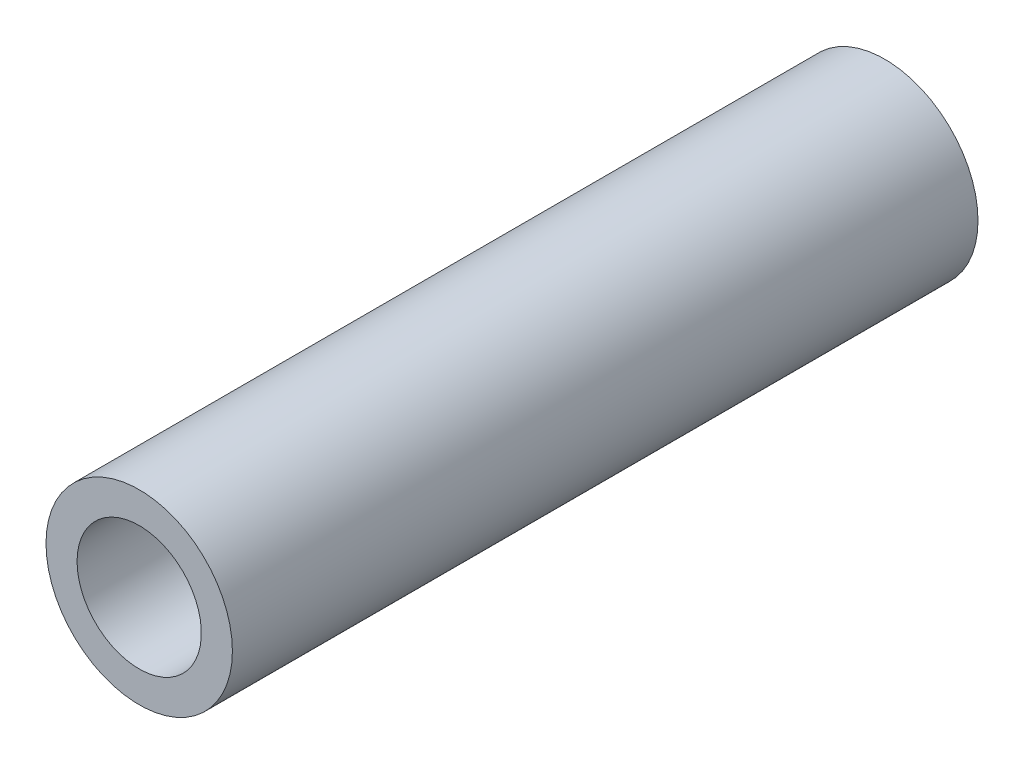
ISO-10303-21;
HEADER;
FILE_DESCRIPTION(('STEP AP214'),'2;1');
FILE_NAME('part.step','',(''),(''),'','','');
FILE_SCHEMA(('AUTOMOTIVE_DESIGN { 1 0 10303 214 1 1 1 1 }'));
ENDSEC;
DATA;
#1=APPLICATION_CONTEXT('core data for automotive mechanical design processes');
#2=APPLICATION_PROTOCOL_DEFINITION('international standard','automotive_design',2000,#1);
#3=PRODUCT_CONTEXT('',#1,'mechanical');
#4=PRODUCT('Part','Part','',(#3));
#5=PRODUCT_RELATED_PRODUCT_CATEGORY('part','',(#4));
#6=PRODUCT_DEFINITION_FORMATION('','',#4);
#7=PRODUCT_DEFINITION_CONTEXT('part definition',#1,'design');
#8=PRODUCT_DEFINITION('design','',#6,#7);
#9=PRODUCT_DEFINITION_SHAPE('','',#8);
#10=(LENGTH_UNIT() NAMED_UNIT(*) SI_UNIT(.MILLI.,.METRE.));
#11=(NAMED_UNIT(*) PLANE_ANGLE_UNIT() SI_UNIT($,.RADIAN.));
#12=(NAMED_UNIT(*) SI_UNIT($,.STERADIAN.) SOLID_ANGLE_UNIT());
#13=UNCERTAINTY_MEASURE_WITH_UNIT(LENGTH_MEASURE(1.E-05),#10,'distance_accuracy_value','');
#14=(GEOMETRIC_REPRESENTATION_CONTEXT(3) GLOBAL_UNCERTAINTY_ASSIGNED_CONTEXT((#13)) GLOBAL_UNIT_ASSIGNED_CONTEXT((#10,
#11,#12)) REPRESENTATION_CONTEXT('',''));
#15=CARTESIAN_POINT('',(0.,0.,0.));
#16=DIRECTION('',(0.,0.,1.));
#17=DIRECTION('',(1.,0.,0.));
#18=AXIS2_PLACEMENT_3D('',#15,#16,#17);
#19=CARTESIAN_POINT('',(0.,0.,19.05));
#20=DIRECTION('',(0.,0.,1.));
#21=DIRECTION('',(1.,0.,0.));
#22=AXIS2_PLACEMENT_3D('',#19,#20,#21);
#23=PLANE('',#22);
#24=CARTESIAN_POINT('',(0.,0.,19.05));
#25=DIRECTION('',(0.,0.,1.));
#26=DIRECTION('',(1.,0.,0.));
#27=AXIS2_PLACEMENT_3D('',#24,#25,#26);
#28=CIRCLE('',#27,2.38125);
#29=CARTESIAN_POINT('',(-2.38125,0.,19.05));
#30=VERTEX_POINT('',#29);
#31=EDGE_CURVE('E10',#30,#30,#28,.T.);
#32=ORIENTED_EDGE('',*,*,#31,.T.);
#33=EDGE_LOOP('',(#32));
#34=FACE_BOUND('',#33,.T.);
#35=CARTESIAN_POINT('',(0.,0.,19.05));
#36=DIRECTION('',(0.,0.,1.));
#37=DIRECTION('',(1.,0.,0.));
#38=AXIS2_PLACEMENT_3D('',#35,#36,#37);
#39=CIRCLE('',#38,1.5875);
#40=CARTESIAN_POINT('',(-1.5875,0.,19.05));
#41=VERTEX_POINT('',#40);
#42=EDGE_CURVE('E42',#41,#41,#39,.T.);
#43=ORIENTED_EDGE('',*,*,#42,.F.);
#44=EDGE_LOOP('',(#43));
#45=FACE_BOUND('',#44,.T.);
#46=ADVANCED_FACE('F31',(#34,#45),#23,.T.);
#47=CARTESIAN_POINT('',(0.,0.,0.));
#48=DIRECTION('',(0.,0.,1.));
#49=DIRECTION('',(1.,0.,0.));
#50=AXIS2_PLACEMENT_3D('',#47,#48,#49);
#51=PLANE('',#50);
#52=CARTESIAN_POINT('',(0.,0.,0.));
#53=DIRECTION('',(0.,0.,1.));
#54=DIRECTION('',(1.,0.,0.));
#55=AXIS2_PLACEMENT_3D('',#52,#53,#54);
#56=CIRCLE('',#55,2.38125);
#57=CARTESIAN_POINT('',(-2.38125,0.,0.));
#58=VERTEX_POINT('',#57);
#59=EDGE_CURVE('E35',#58,#58,#56,.T.);
#60=ORIENTED_EDGE('',*,*,#59,.F.);
#61=EDGE_LOOP('',(#60));
#62=FACE_BOUND('',#61,.T.);
#63=CARTESIAN_POINT('',(0.,0.,0.));
#64=DIRECTION('',(0.,0.,1.));
#65=DIRECTION('',(1.,0.,0.));
#66=AXIS2_PLACEMENT_3D('',#63,#64,#65);
#67=CIRCLE('',#66,1.5875);
#68=CARTESIAN_POINT('',(-1.5875,0.,0.));
#69=VERTEX_POINT('',#68);
#70=EDGE_CURVE('E44',#69,#69,#67,.T.);
#71=ORIENTED_EDGE('',*,*,#70,.T.);
#72=EDGE_LOOP('',(#71));
#73=FACE_BOUND('',#72,.T.);
#74=ADVANCED_FACE('F54',(#62,#73),#51,.F.);
#75=CARTESIAN_POINT('',(0.,0.,19.05));
#76=DIRECTION('',(0.,0.,-1.));
#77=DIRECTION('',(-1.,0.,0.));
#78=AXIS2_PLACEMENT_3D('',#75,#76,#77);
#79=CYLINDRICAL_SURFACE('',#78,2.38125);
#80=CARTESIAN_POINT('',(-2.38125,0.,19.05));
#81=CARTESIAN_POINT('',(-2.38125,0.,18.8515625));
#82=CARTESIAN_POINT('',(-2.38125,0.,18.653125));
#83=CARTESIAN_POINT('',(-2.38125,0.,18.25625));
#84=CARTESIAN_POINT('',(-2.38125,0.,18.0578125));
#85=CARTESIAN_POINT('',(-2.38125,0.,17.6609375));
#86=CARTESIAN_POINT('',(-2.38125,0.,17.4625));
#87=CARTESIAN_POINT('',(-2.38125,0.,17.065625));
#88=CARTESIAN_POINT('',(-2.38125,0.,16.8671875));
#89=CARTESIAN_POINT('',(-2.38125,0.,16.4703125));
#90=CARTESIAN_POINT('',(-2.38125,0.,16.271875));
#91=CARTESIAN_POINT('',(-2.38125,0.,15.875));
#92=CARTESIAN_POINT('',(-2.38125,0.,15.6765625));
#93=CARTESIAN_POINT('',(-2.38125,0.,15.2796875));
#94=CARTESIAN_POINT('',(-2.38125,0.,15.08125));
#95=CARTESIAN_POINT('',(-2.38125,0.,14.684375));
#96=CARTESIAN_POINT('',(-2.38125,0.,14.4859375));
#97=CARTESIAN_POINT('',(-2.38125,0.,14.0890625));
#98=CARTESIAN_POINT('',(-2.38125,0.,13.890625));
#99=CARTESIAN_POINT('',(-2.38125,0.,13.49375));
#100=CARTESIAN_POINT('',(-2.38125,0.,13.2953125));
#101=CARTESIAN_POINT('',(-2.38125,0.,12.8984375));
#102=CARTESIAN_POINT('',(-2.38125,0.,12.7));
#103=CARTESIAN_POINT('',(-2.38125,0.,12.303125));
#104=CARTESIAN_POINT('',(-2.38125,0.,12.1046875));
#105=CARTESIAN_POINT('',(-2.38125,0.,11.7078125));
#106=CARTESIAN_POINT('',(-2.38125,0.,11.509375));
#107=CARTESIAN_POINT('',(-2.38125,0.,11.1125));
#108=CARTESIAN_POINT('',(-2.38125,0.,10.9140625));
#109=CARTESIAN_POINT('',(-2.38125,0.,10.5171875));
#110=CARTESIAN_POINT('',(-2.38125,0.,10.31875));
#111=CARTESIAN_POINT('',(-2.38125,0.,9.921875));
#112=CARTESIAN_POINT('',(-2.38125,0.,9.7234375));
#113=CARTESIAN_POINT('',(-2.38125,0.,9.3265625));
#114=CARTESIAN_POINT('',(-2.38125,0.,9.128125));
#115=CARTESIAN_POINT('',(-2.38125,0.,8.73125));
#116=CARTESIAN_POINT('',(-2.38125,0.,8.5328125));
#117=CARTESIAN_POINT('',(-2.38125,0.,8.1359375));
#118=CARTESIAN_POINT('',(-2.38125,0.,7.9375));
#119=CARTESIAN_POINT('',(-2.38125,0.,7.540625));
#120=CARTESIAN_POINT('',(-2.38125,0.,7.3421875));
#121=CARTESIAN_POINT('',(-2.38125,0.,6.9453125));
#122=CARTESIAN_POINT('',(-2.38125,0.,6.746875));
#123=CARTESIAN_POINT('',(-2.38125,0.,6.35));
#124=CARTESIAN_POINT('',(-2.38125,0.,6.1515625));
#125=CARTESIAN_POINT('',(-2.38125,0.,5.7546875));
#126=CARTESIAN_POINT('',(-2.38125,0.,5.55625));
#127=CARTESIAN_POINT('',(-2.38125,0.,5.159375));
#128=CARTESIAN_POINT('',(-2.38125,0.,4.9609375));
#129=CARTESIAN_POINT('',(-2.38125,0.,4.5640625));
#130=CARTESIAN_POINT('',(-2.38125,0.,4.365625));
#131=CARTESIAN_POINT('',(-2.38125,0.,3.96875));
#132=CARTESIAN_POINT('',(-2.38125,0.,3.7703125));
#133=CARTESIAN_POINT('',(-2.38125,0.,3.3734375));
#134=CARTESIAN_POINT('',(-2.38125,0.,3.175));
#135=CARTESIAN_POINT('',(-2.38125,0.,2.778125));
#136=CARTESIAN_POINT('',(-2.38125,0.,2.5796875));
#137=CARTESIAN_POINT('',(-2.38125,0.,2.1828125));
#138=CARTESIAN_POINT('',(-2.38125,0.,1.984375));
#139=CARTESIAN_POINT('',(-2.38125,0.,1.5875));
#140=CARTESIAN_POINT('',(-2.38125,0.,1.3890625));
#141=CARTESIAN_POINT('',(-2.38125,0.,0.992187500000001));
#142=CARTESIAN_POINT('',(-2.38125,0.,0.793750000000001));
#143=CARTESIAN_POINT('',(-2.38125,0.,0.396875));
#144=CARTESIAN_POINT('',(-2.38125,0.,0.1984375));
#145=CARTESIAN_POINT('',(-2.38125,0.,0.));
#146=B_SPLINE_CURVE_WITH_KNOTS('',3,(#80,#81,#82,#83,#84,#85,#86,#87,#88,#89,#90,#91,#92,#93,
#94,#95,#96,#97,#98,#99,#100,#101,#102,#103,#104,#105,#106,#107,#108,#109,#110,#111,#112,#113,
#114,#115,#116,#117,#118,#119,#120,#121,#122,#123,#124,#125,#126,#127,#128,#129,#130,#131,#132,
#133,#134,#135,#136,#137,#138,#139,#140,#141,#142,#143,#144,#145),.UNSPECIFIED.,.F.,.F.,(4,2,2,
2,2,2,2,2,2,2,2,2,2,2,2,2,2,2,2,2,2,2,2,2,2,2,2,2,2,2,2,2,4),(0.,0.5953125,1.190625,1.7859375,
2.38125,2.9765625,3.571875,4.1671875,4.7625,5.3578125,5.953125,6.5484375,7.14375,7.7390625,
8.334375,8.9296875,9.525,10.1203125,10.715625,11.3109375,11.90625,12.5015625,13.096875,
13.6921875,14.2875,14.8828125,15.478125,16.0734375,16.66875,17.2640625,17.859375,18.4546875,
19.05),.UNSPECIFIED.);
#147=EDGE_CURVE('BSEAM33',#30,#58,#146,.T.);
#148=ORIENTED_EDGE('',*,*,#31,.F.);
#149=ORIENTED_EDGE('',*,*,#59,.T.);
#150=ORIENTED_EDGE('',*,*,#147,.T.);
#151=ORIENTED_EDGE('',*,*,#147,.F.);
#152=EDGE_LOOP('',(#148,#150,#149,#151));
#153=FACE_BOUND('',#152,.T.);
#154=ADVANCED_FACE('F33',(#153),#79,.T.);
#155=CARTESIAN_POINT('',(0.,0.,19.05));
#156=DIRECTION('',(0.,0.,-1.));
#157=DIRECTION('',(-1.,0.,0.));
#158=AXIS2_PLACEMENT_3D('',#155,#156,#157);
#159=CYLINDRICAL_SURFACE('',#158,1.5875);
#160=CARTESIAN_POINT('',(-1.5875,0.,19.05));
#161=CARTESIAN_POINT('',(-1.5875,0.,18.8515625));
#162=CARTESIAN_POINT('',(-1.5875,0.,18.653125));
#163=CARTESIAN_POINT('',(-1.5875,0.,18.25625));
#164=CARTESIAN_POINT('',(-1.5875,0.,18.0578125));
#165=CARTESIAN_POINT('',(-1.5875,0.,17.6609375));
#166=CARTESIAN_POINT('',(-1.5875,0.,17.4625));
#167=CARTESIAN_POINT('',(-1.5875,0.,17.065625));
#168=CARTESIAN_POINT('',(-1.5875,0.,16.8671875));
#169=CARTESIAN_POINT('',(-1.5875,0.,16.4703125));
#170=CARTESIAN_POINT('',(-1.5875,0.,16.271875));
#171=CARTESIAN_POINT('',(-1.5875,0.,15.875));
#172=CARTESIAN_POINT('',(-1.5875,0.,15.6765625));
#173=CARTESIAN_POINT('',(-1.5875,0.,15.2796875));
#174=CARTESIAN_POINT('',(-1.5875,0.,15.08125));
#175=CARTESIAN_POINT('',(-1.5875,0.,14.684375));
#176=CARTESIAN_POINT('',(-1.5875,0.,14.4859375));
#177=CARTESIAN_POINT('',(-1.5875,0.,14.0890625));
#178=CARTESIAN_POINT('',(-1.5875,0.,13.890625));
#179=CARTESIAN_POINT('',(-1.5875,0.,13.49375));
#180=CARTESIAN_POINT('',(-1.5875,0.,13.2953125));
#181=CARTESIAN_POINT('',(-1.5875,0.,12.8984375));
#182=CARTESIAN_POINT('',(-1.5875,0.,12.7));
#183=CARTESIAN_POINT('',(-1.5875,0.,12.303125));
#184=CARTESIAN_POINT('',(-1.5875,0.,12.1046875));
#185=CARTESIAN_POINT('',(-1.5875,0.,11.7078125));
#186=CARTESIAN_POINT('',(-1.5875,0.,11.509375));
#187=CARTESIAN_POINT('',(-1.5875,0.,11.1125));
#188=CARTESIAN_POINT('',(-1.5875,0.,10.9140625));
#189=CARTESIAN_POINT('',(-1.5875,0.,10.5171875));
#190=CARTESIAN_POINT('',(-1.5875,0.,10.31875));
#191=CARTESIAN_POINT('',(-1.5875,0.,9.921875));
#192=CARTESIAN_POINT('',(-1.5875,0.,9.7234375));
#193=CARTESIAN_POINT('',(-1.5875,0.,9.3265625));
#194=CARTESIAN_POINT('',(-1.5875,0.,9.128125));
#195=CARTESIAN_POINT('',(-1.5875,0.,8.73125));
#196=CARTESIAN_POINT('',(-1.5875,0.,8.5328125));
#197=CARTESIAN_POINT('',(-1.5875,0.,8.1359375));
#198=CARTESIAN_POINT('',(-1.5875,0.,7.9375));
#199=CARTESIAN_POINT('',(-1.5875,0.,7.540625));
#200=CARTESIAN_POINT('',(-1.5875,0.,7.3421875));
#201=CARTESIAN_POINT('',(-1.5875,0.,6.9453125));
#202=CARTESIAN_POINT('',(-1.5875,0.,6.746875));
#203=CARTESIAN_POINT('',(-1.5875,0.,6.35));
#204=CARTESIAN_POINT('',(-1.5875,0.,6.1515625));
#205=CARTESIAN_POINT('',(-1.5875,0.,5.7546875));
#206=CARTESIAN_POINT('',(-1.5875,0.,5.55625));
#207=CARTESIAN_POINT('',(-1.5875,0.,5.159375));
#208=CARTESIAN_POINT('',(-1.5875,0.,4.9609375));
#209=CARTESIAN_POINT('',(-1.5875,0.,4.5640625));
#210=CARTESIAN_POINT('',(-1.5875,0.,4.365625));
#211=CARTESIAN_POINT('',(-1.5875,0.,3.96875));
#212=CARTESIAN_POINT('',(-1.5875,0.,3.7703125));
#213=CARTESIAN_POINT('',(-1.5875,0.,3.3734375));
#214=CARTESIAN_POINT('',(-1.5875,0.,3.175));
#215=CARTESIAN_POINT('',(-1.5875,0.,2.778125));
#216=CARTESIAN_POINT('',(-1.5875,0.,2.5796875));
#217=CARTESIAN_POINT('',(-1.5875,0.,2.1828125));
#218=CARTESIAN_POINT('',(-1.5875,0.,1.984375));
#219=CARTESIAN_POINT('',(-1.5875,0.,1.5875));
#220=CARTESIAN_POINT('',(-1.5875,0.,1.3890625));
#221=CARTESIAN_POINT('',(-1.5875,0.,0.992187500000001));
#222=CARTESIAN_POINT('',(-1.5875,0.,0.793750000000001));
#223=CARTESIAN_POINT('',(-1.5875,0.,0.396875));
#224=CARTESIAN_POINT('',(-1.5875,0.,0.1984375));
#225=CARTESIAN_POINT('',(-1.5875,0.,0.));
#226=B_SPLINE_CURVE_WITH_KNOTS('',3,(#160,#161,#162,#163,#164,#165,#166,#167,#168,#169,#170,
#171,#172,#173,#174,#175,#176,#177,#178,#179,#180,#181,#182,#183,#184,#185,#186,#187,#188,#189,
#190,#191,#192,#193,#194,#195,#196,#197,#198,#199,#200,#201,#202,#203,#204,#205,#206,#207,#208,
#209,#210,#211,#212,#213,#214,#215,#216,#217,#218,#219,#220,#221,#222,#223,#224,#225),
.UNSPECIFIED.,.F.,.F.,(4,2,2,2,2,2,2,2,2,2,2,2,2,2,2,2,2,2,2,2,2,2,2,2,2,2,2,2,2,2,2,2,4),(0.,
0.595312499999997,1.190625,1.7859375,2.38125,2.9765625,3.571875,4.1671875,4.7625,5.3578125,
5.953125,6.5484375,7.14375,7.7390625,8.334375,8.9296875,9.525,10.1203125,10.715625,11.3109375,
11.90625,12.5015625,13.096875,13.6921875,14.2875,14.8828125,15.478125,16.0734375,16.66875,
17.2640625,17.859375,18.4546875,19.05),.UNSPECIFIED.);
#227=EDGE_CURVE('BSEAM50',#41,#69,#226,.T.);
#228=ORIENTED_EDGE('',*,*,#42,.T.);
#229=ORIENTED_EDGE('',*,*,#70,.F.);
#230=ORIENTED_EDGE('',*,*,#227,.T.);
#231=ORIENTED_EDGE('',*,*,#227,.F.);
#232=EDGE_LOOP('',(#228,#230,#229,#231));
#233=FACE_BOUND('',#232,.T.);
#234=ADVANCED_FACE('F50',(#233),#159,.F.);
#235=CLOSED_SHELL('',(#46,#74,#154,#234));
#236=MANIFOLD_SOLID_BREP('B2',#235);
#237=ADVANCED_BREP_SHAPE_REPRESENTATION('',(#18,#236),#14);
#238=SHAPE_DEFINITION_REPRESENTATION(#9,#237);
ENDSEC;
END-ISO-10303-21;
